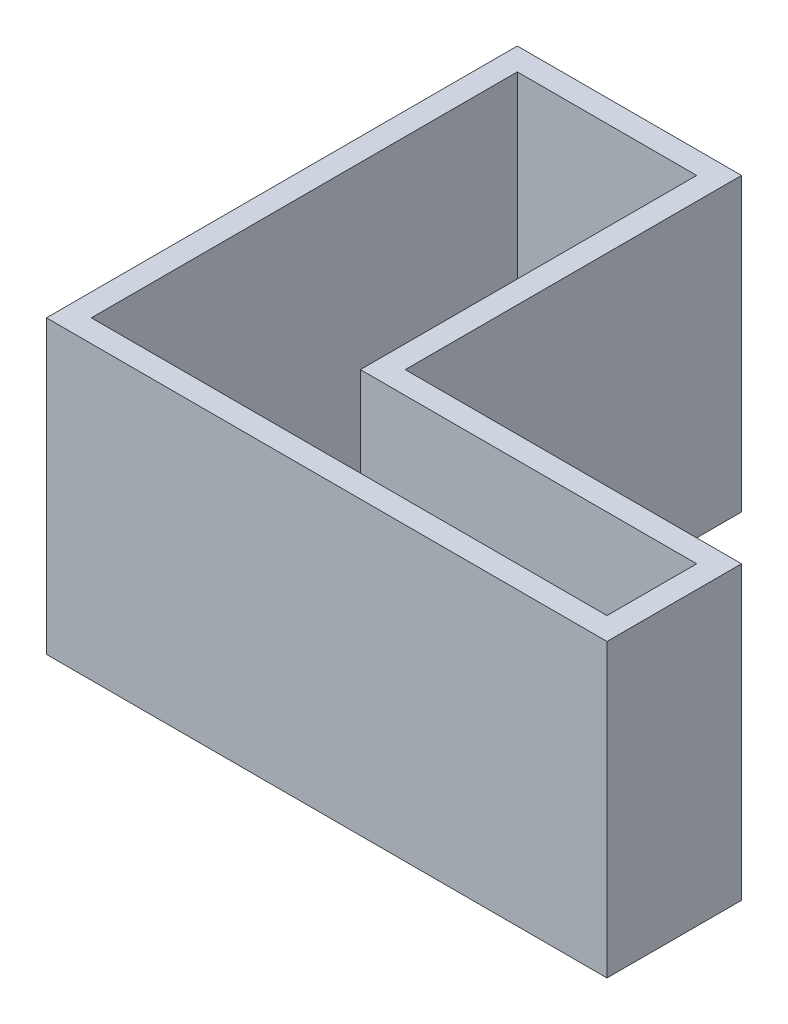
ISO-10303-21;
HEADER;
FILE_DESCRIPTION(('STEP AP214'),'2;1');
FILE_NAME('part.step','',(''),(''),'','','');
FILE_SCHEMA(('AUTOMOTIVE_DESIGN { 1 0 10303 214 1 1 1 1 }'));
ENDSEC;
DATA;
#1=APPLICATION_CONTEXT('core data for automotive mechanical design processes');
#2=APPLICATION_PROTOCOL_DEFINITION('international standard','automotive_design',2000,#1);
#3=PRODUCT_CONTEXT('',#1,'mechanical');
#4=PRODUCT('Part','Part','',(#3));
#5=PRODUCT_RELATED_PRODUCT_CATEGORY('part','',(#4));
#6=PRODUCT_DEFINITION_FORMATION('','',#4);
#7=PRODUCT_DEFINITION_CONTEXT('part definition',#1,'design');
#8=PRODUCT_DEFINITION('design','',#6,#7);
#9=PRODUCT_DEFINITION_SHAPE('','',#8);
#10=(LENGTH_UNIT() NAMED_UNIT(*) SI_UNIT(.MILLI.,.METRE.));
#11=(NAMED_UNIT(*) PLANE_ANGLE_UNIT() SI_UNIT($,.RADIAN.));
#12=(NAMED_UNIT(*) SI_UNIT($,.STERADIAN.) SOLID_ANGLE_UNIT());
#13=UNCERTAINTY_MEASURE_WITH_UNIT(LENGTH_MEASURE(1.E-05),#10,'distance_accuracy_value','');
#14=(GEOMETRIC_REPRESENTATION_CONTEXT(3) GLOBAL_UNCERTAINTY_ASSIGNED_CONTEXT((#13)) GLOBAL_UNIT_ASSIGNED_CONTEXT((#10,
#11,#12)) REPRESENTATION_CONTEXT('',''));
#15=CARTESIAN_POINT('',(0.,0.,0.));
#16=DIRECTION('',(0.,0.,1.));
#17=DIRECTION('',(1.,0.,0.));
#18=AXIS2_PLACEMENT_3D('',#15,#16,#17);
#19=CARTESIAN_POINT('',(0.,12.,0.));
#20=DIRECTION('',(0.,-1.,0.));
#21=DIRECTION('',(0.,0.,-1.));
#22=AXIS2_PLACEMENT_3D('',#19,#20,#21);
#23=PLANE('',#22);
#24=DIRECTION('',(1.,0.,0.));
#25=VECTOR('',#24,1.);
#26=CARTESIAN_POINT('',(25.,12.,0.));
#27=LINE('',#26,#25);
#28=CARTESIAN_POINT('',(0.,12.,0.));
#29=VERTEX_POINT('',#28);
#30=CARTESIAN_POINT('',(25.,12.,0.));
#31=VERTEX_POINT('',#30);
#32=EDGE_CURVE('E199',#29,#31,#27,.T.);
#33=ORIENTED_EDGE('',*,*,#32,.T.);
#34=DIRECTION('',(0.,0.,-1.));
#35=VECTOR('',#34,1.);
#36=CARTESIAN_POINT('',(25.,12.,-6.));
#37=LINE('',#36,#35);
#38=CARTESIAN_POINT('',(25.,12.,-6.));
#39=VERTEX_POINT('',#38);
#40=EDGE_CURVE('E202',#31,#39,#37,.T.);
#41=ORIENTED_EDGE('',*,*,#40,.T.);
#42=DIRECTION('',(-1.,0.,0.));
#43=VECTOR('',#42,1.);
#44=CARTESIAN_POINT('',(10.,12.,-6.));
#45=LINE('',#44,#43);
#46=CARTESIAN_POINT('',(10.,12.,-6.));
#47=VERTEX_POINT('',#46);
#48=EDGE_CURVE('E204',#39,#47,#45,.T.);
#49=ORIENTED_EDGE('',*,*,#48,.T.);
#50=DIRECTION('',(0.,0.,-1.));
#51=VECTOR('',#50,1.);
#52=CARTESIAN_POINT('',(10.,12.,-21.));
#53=LINE('',#52,#51);
#54=CARTESIAN_POINT('',(10.,12.,-21.));
#55=VERTEX_POINT('',#54);
#56=EDGE_CURVE('E132',#47,#55,#53,.T.);
#57=ORIENTED_EDGE('',*,*,#56,.T.);
#58=DIRECTION('',(-1.,0.,0.));
#59=VECTOR('',#58,1.);
#60=CARTESIAN_POINT('',(0.,12.,-21.));
#61=LINE('',#60,#59);
#62=CARTESIAN_POINT('',(0.,12.,-21.));
#63=VERTEX_POINT('',#62);
#64=EDGE_CURVE('E207',#55,#63,#61,.T.);
#65=ORIENTED_EDGE('',*,*,#64,.T.);
#66=DIRECTION('',(0.,0.,1.));
#67=VECTOR('',#66,1.);
#68=CARTESIAN_POINT('',(0.,12.,0.));
#69=LINE('',#68,#67);
#70=EDGE_CURVE('E209',#63,#29,#69,.T.);
#71=ORIENTED_EDGE('',*,*,#70,.T.);
#72=EDGE_LOOP('',(#33,#41,#49,#57,#65,#71));
#73=FACE_BOUND('',#72,.T.);
#74=DIRECTION('',(0.,0.,1.));
#75=VECTOR('',#74,1.);
#76=CARTESIAN_POINT('',(1.,12.,-1.));
#77=LINE('',#76,#75);
#78=CARTESIAN_POINT('',(1.,12.,-20.));
#79=VERTEX_POINT('',#78);
#80=CARTESIAN_POINT('',(1.,12.,-1.));
#81=VERTEX_POINT('',#80);
#82=EDGE_CURVE('E160',#79,#81,#77,.T.);
#83=ORIENTED_EDGE('',*,*,#82,.F.);
#84=DIRECTION('',(-1.,0.,0.));
#85=VECTOR('',#84,1.);
#86=CARTESIAN_POINT('',(1.,12.,-20.));
#87=LINE('',#86,#85);
#88=CARTESIAN_POINT('',(9.00000000000003,12.,-20.));
#89=VERTEX_POINT('',#88);
#90=EDGE_CURVE('E171',#89,#79,#87,.T.);
#91=ORIENTED_EDGE('',*,*,#90,.F.);
#92=DIRECTION('',(0.,0.,-1.));
#93=VECTOR('',#92,1.);
#94=CARTESIAN_POINT('',(9.00000000000003,12.,-20.));
#95=LINE('',#94,#93);
#96=CARTESIAN_POINT('',(9.00000000000003,12.,-5.));
#97=VERTEX_POINT('',#96);
#98=EDGE_CURVE('E169',#97,#89,#95,.T.);
#99=ORIENTED_EDGE('',*,*,#98,.F.);
#100=DIRECTION('',(-1.,0.,0.));
#101=VECTOR('',#100,1.);
#102=CARTESIAN_POINT('',(9.00000000000003,12.,-5.));
#103=LINE('',#102,#101);
#104=CARTESIAN_POINT('',(24.,12.,-5.));
#105=VERTEX_POINT('',#104);
#106=EDGE_CURVE('E167',#105,#97,#103,.T.);
#107=ORIENTED_EDGE('',*,*,#106,.F.);
#108=DIRECTION('',(0.,0.,-1.));
#109=VECTOR('',#108,1.);
#110=CARTESIAN_POINT('',(24.,12.,-5.));
#111=LINE('',#110,#109);
#112=CARTESIAN_POINT('',(24.,12.,-1.));
#113=VERTEX_POINT('',#112);
#114=EDGE_CURVE('E165',#113,#105,#111,.T.);
#115=ORIENTED_EDGE('',*,*,#114,.F.);
#116=DIRECTION('',(1.,0.,0.));
#117=VECTOR('',#116,1.);
#118=CARTESIAN_POINT('',(24.,12.,-1.));
#119=LINE('',#118,#117);
#120=EDGE_CURVE('E162',#81,#113,#119,.T.);
#121=ORIENTED_EDGE('',*,*,#120,.F.);
#122=EDGE_LOOP('',(#83,#91,#99,#107,#115,#121));
#123=FACE_BOUND('',#122,.T.);
#124=ADVANCED_FACE('F35',(#73,#123),#23,.F.);
#125=CARTESIAN_POINT('',(25.,12.,0.));
#126=DIRECTION('',(0.,0.,-1.));
#127=DIRECTION('',(-1.,0.,0.));
#128=AXIS2_PLACEMENT_3D('',#125,#126,#127);
#129=PLANE('',#128);
#130=DIRECTION('',(0.,-1.,0.));
#131=VECTOR('',#130,1.);
#132=CARTESIAN_POINT('',(0.,12.,0.));
#133=LINE('',#132,#131);
#134=CARTESIAN_POINT('',(0.,-1.,0.));
#135=VERTEX_POINT('',#134);
#136=EDGE_CURVE('E211',#29,#135,#133,.T.);
#137=ORIENTED_EDGE('',*,*,#136,.T.);
#138=DIRECTION('',(-1.,0.,0.));
#139=VECTOR('',#138,1.);
#140=CARTESIAN_POINT('',(0.,-1.,0.));
#141=LINE('',#140,#139);
#142=CARTESIAN_POINT('',(25.,-1.,0.));
#143=VERTEX_POINT('',#142);
#144=EDGE_CURVE('E154',#143,#135,#141,.T.);
#145=ORIENTED_EDGE('',*,*,#144,.F.);
#146=DIRECTION('',(0.,-1.,0.));
#147=VECTOR('',#146,1.);
#148=CARTESIAN_POINT('',(25.,12.,0.));
#149=LINE('',#148,#147);
#150=EDGE_CURVE('E11',#31,#143,#149,.T.);
#151=ORIENTED_EDGE('',*,*,#150,.F.);
#152=ORIENTED_EDGE('',*,*,#32,.F.);
#153=EDGE_LOOP('',(#137,#145,#151,#152));
#154=FACE_BOUND('',#153,.T.);
#155=ADVANCED_FACE('F37',(#154),#129,.F.);
#156=CARTESIAN_POINT('',(25.,12.,-6.));
#157=DIRECTION('',(-1.,0.,0.));
#158=DIRECTION('',(0.,0.,1.));
#159=AXIS2_PLACEMENT_3D('',#156,#157,#158);
#160=PLANE('',#159);
#161=ORIENTED_EDGE('',*,*,#150,.T.);
#162=DIRECTION('',(0.,0.,1.));
#163=VECTOR('',#162,1.);
#164=CARTESIAN_POINT('',(25.,-1.,0.));
#165=LINE('',#164,#163);
#166=CARTESIAN_POINT('',(25.,-1.,-6.));
#167=VERTEX_POINT('',#166);
#168=EDGE_CURVE('E144',#167,#143,#165,.T.);
#169=ORIENTED_EDGE('',*,*,#168,.F.);
#170=DIRECTION('',(0.,-1.,0.));
#171=VECTOR('',#170,1.);
#172=CARTESIAN_POINT('',(25.,12.,-6.));
#173=LINE('',#172,#171);
#174=EDGE_CURVE('E43',#39,#167,#173,.T.);
#175=ORIENTED_EDGE('',*,*,#174,.F.);
#176=ORIENTED_EDGE('',*,*,#40,.F.);
#177=EDGE_LOOP('',(#161,#169,#175,#176));
#178=FACE_BOUND('',#177,.T.);
#179=ADVANCED_FACE('F226',(#178),#160,.F.);
#180=CARTESIAN_POINT('',(10.,12.,-6.));
#181=DIRECTION('',(0.,0.,1.));
#182=DIRECTION('',(1.,0.,0.));
#183=AXIS2_PLACEMENT_3D('',#180,#181,#182);
#184=PLANE('',#183);
#185=ORIENTED_EDGE('',*,*,#174,.T.);
#186=DIRECTION('',(1.,0.,0.));
#187=VECTOR('',#186,1.);
#188=CARTESIAN_POINT('',(25.,-1.,-6.));
#189=LINE('',#188,#187);
#190=CARTESIAN_POINT('',(10.,-1.,-6.));
#191=VERTEX_POINT('',#190);
#192=EDGE_CURVE('E138',#191,#167,#189,.T.);
#193=ORIENTED_EDGE('',*,*,#192,.F.);
#194=DIRECTION('',(0.,-1.,0.));
#195=VECTOR('',#194,1.);
#196=CARTESIAN_POINT('',(10.,12.,-6.));
#197=LINE('',#196,#195);
#198=EDGE_CURVE('E126',#47,#191,#197,.T.);
#199=ORIENTED_EDGE('',*,*,#198,.F.);
#200=ORIENTED_EDGE('',*,*,#48,.F.);
#201=EDGE_LOOP('',(#185,#193,#199,#200));
#202=FACE_BOUND('',#201,.T.);
#203=ADVANCED_FACE('F139',(#202),#184,.F.);
#204=CARTESIAN_POINT('',(10.,12.,-21.));
#205=DIRECTION('',(-1.,0.,0.));
#206=DIRECTION('',(0.,0.,1.));
#207=AXIS2_PLACEMENT_3D('',#204,#205,#206);
#208=PLANE('',#207);
#209=ORIENTED_EDGE('',*,*,#198,.T.);
#210=DIRECTION('',(0.,0.,1.));
#211=VECTOR('',#210,1.);
#212=CARTESIAN_POINT('',(10.,-1.,-6.));
#213=LINE('',#212,#211);
#214=CARTESIAN_POINT('',(10.,-1.,-21.));
#215=VERTEX_POINT('',#214);
#216=EDGE_CURVE('E131',#215,#191,#213,.T.);
#217=ORIENTED_EDGE('',*,*,#216,.F.);
#218=DIRECTION('',(0.,-1.,0.));
#219=VECTOR('',#218,1.);
#220=CARTESIAN_POINT('',(10.,12.,-21.));
#221=LINE('',#220,#219);
#222=EDGE_CURVE('E135',#55,#215,#221,.T.);
#223=ORIENTED_EDGE('',*,*,#222,.F.);
#224=ORIENTED_EDGE('',*,*,#56,.F.);
#225=EDGE_LOOP('',(#209,#217,#223,#224));
#226=FACE_BOUND('',#225,.T.);
#227=ADVANCED_FACE('F128',(#226),#208,.F.);
#228=CARTESIAN_POINT('',(0.,12.,-21.));
#229=DIRECTION('',(0.,0.,1.));
#230=DIRECTION('',(1.,0.,0.));
#231=AXIS2_PLACEMENT_3D('',#228,#229,#230);
#232=PLANE('',#231);
#233=ORIENTED_EDGE('',*,*,#222,.T.);
#234=DIRECTION('',(1.,0.,0.));
#235=VECTOR('',#234,1.);
#236=CARTESIAN_POINT('',(10.,-1.,-21.));
#237=LINE('',#236,#235);
#238=CARTESIAN_POINT('',(0.,-1.,-21.));
#239=VERTEX_POINT('',#238);
#240=EDGE_CURVE('E150',#239,#215,#237,.T.);
#241=ORIENTED_EDGE('',*,*,#240,.F.);
#242=DIRECTION('',(0.,-1.,0.));
#243=VECTOR('',#242,1.);
#244=CARTESIAN_POINT('',(0.,12.,-21.));
#245=LINE('',#244,#243);
#246=EDGE_CURVE('E213',#63,#239,#245,.T.);
#247=ORIENTED_EDGE('',*,*,#246,.F.);
#248=ORIENTED_EDGE('',*,*,#64,.F.);
#249=EDGE_LOOP('',(#233,#241,#247,#248));
#250=FACE_BOUND('',#249,.T.);
#251=ADVANCED_FACE('F217',(#250),#232,.F.);
#252=CARTESIAN_POINT('',(0.,12.,0.));
#253=DIRECTION('',(1.,0.,0.));
#254=DIRECTION('',(0.,0.,-1.));
#255=AXIS2_PLACEMENT_3D('',#252,#253,#254);
#256=PLANE('',#255);
#257=ORIENTED_EDGE('',*,*,#246,.T.);
#258=DIRECTION('',(0.,0.,-1.));
#259=VECTOR('',#258,1.);
#260=CARTESIAN_POINT('',(0.,-1.,-21.));
#261=LINE('',#260,#259);
#262=EDGE_CURVE('E157',#135,#239,#261,.T.);
#263=ORIENTED_EDGE('',*,*,#262,.F.);
#264=ORIENTED_EDGE('',*,*,#136,.F.);
#265=ORIENTED_EDGE('',*,*,#70,.F.);
#266=EDGE_LOOP('',(#257,#263,#264,#265));
#267=FACE_BOUND('',#266,.T.);
#268=ADVANCED_FACE('F231',(#267),#256,.F.);
#269=CARTESIAN_POINT('',(1.,12.,-1.));
#270=DIRECTION('',(1.,0.,0.));
#271=DIRECTION('',(0.,0.,-1.));
#272=AXIS2_PLACEMENT_3D('',#269,#270,#271);
#273=PLANE('',#272);
#274=DIRECTION('',(0.,0.,1.));
#275=VECTOR('',#274,1.);
#276=CARTESIAN_POINT('',(1.,0.,-1.));
#277=LINE('',#276,#275);
#278=CARTESIAN_POINT('',(1.,0.,-20.));
#279=VERTEX_POINT('',#278);
#280=CARTESIAN_POINT('',(1.,0.,-1.));
#281=VERTEX_POINT('',#280);
#282=EDGE_CURVE('E58',#279,#281,#277,.T.);
#283=ORIENTED_EDGE('',*,*,#282,.F.);
#284=DIRECTION('',(0.,-1.,0.));
#285=VECTOR('',#284,1.);
#286=CARTESIAN_POINT('',(1.,12.,-20.));
#287=LINE('',#286,#285);
#288=EDGE_CURVE('E173',#79,#279,#287,.T.);
#289=ORIENTED_EDGE('',*,*,#288,.F.);
#290=ORIENTED_EDGE('',*,*,#82,.T.);
#291=DIRECTION('',(0.,-1.,0.));
#292=VECTOR('',#291,1.);
#293=CARTESIAN_POINT('',(1.,12.,-1.));
#294=LINE('',#293,#292);
#295=EDGE_CURVE('E197',#81,#281,#294,.T.);
#296=ORIENTED_EDGE('',*,*,#295,.T.);
#297=EDGE_LOOP('',(#283,#289,#290,#296));
#298=FACE_BOUND('',#297,.T.);
#299=ADVANCED_FACE('F233',(#298),#273,.T.);
#300=CARTESIAN_POINT('',(24.,12.,-1.));
#301=DIRECTION('',(0.,0.,-1.));
#302=DIRECTION('',(-1.,0.,0.));
#303=AXIS2_PLACEMENT_3D('',#300,#301,#302);
#304=PLANE('',#303);
#305=DIRECTION('',(1.,0.,0.));
#306=VECTOR('',#305,1.);
#307=CARTESIAN_POINT('',(24.,0.,-1.));
#308=LINE('',#307,#306);
#309=CARTESIAN_POINT('',(24.,0.,-1.));
#310=VERTEX_POINT('',#309);
#311=EDGE_CURVE('E175',#281,#310,#308,.T.);
#312=ORIENTED_EDGE('',*,*,#311,.F.);
#313=ORIENTED_EDGE('',*,*,#295,.F.);
#314=ORIENTED_EDGE('',*,*,#120,.T.);
#315=DIRECTION('',(0.,-1.,0.));
#316=VECTOR('',#315,1.);
#317=CARTESIAN_POINT('',(24.,12.,-1.));
#318=LINE('',#317,#316);
#319=EDGE_CURVE('E195',#113,#310,#318,.T.);
#320=ORIENTED_EDGE('',*,*,#319,.T.);
#321=EDGE_LOOP('',(#312,#313,#314,#320));
#322=FACE_BOUND('',#321,.T.);
#323=ADVANCED_FACE('F239',(#322),#304,.T.);
#324=CARTESIAN_POINT('',(24.,12.,-5.));
#325=DIRECTION('',(-1.,0.,0.));
#326=DIRECTION('',(0.,0.,1.));
#327=AXIS2_PLACEMENT_3D('',#324,#325,#326);
#328=PLANE('',#327);
#329=DIRECTION('',(0.,0.,-1.));
#330=VECTOR('',#329,1.);
#331=CARTESIAN_POINT('',(24.,0.,-5.));
#332=LINE('',#331,#330);
#333=CARTESIAN_POINT('',(24.,0.,-5.));
#334=VERTEX_POINT('',#333);
#335=EDGE_CURVE('E178',#310,#334,#332,.T.);
#336=ORIENTED_EDGE('',*,*,#335,.F.);
#337=ORIENTED_EDGE('',*,*,#319,.F.);
#338=ORIENTED_EDGE('',*,*,#114,.T.);
#339=DIRECTION('',(0.,-1.,0.));
#340=VECTOR('',#339,1.);
#341=CARTESIAN_POINT('',(24.,12.,-5.));
#342=LINE('',#341,#340);
#343=EDGE_CURVE('E193',#105,#334,#342,.T.);
#344=ORIENTED_EDGE('',*,*,#343,.T.);
#345=EDGE_LOOP('',(#336,#337,#338,#344));
#346=FACE_BOUND('',#345,.T.);
#347=ADVANCED_FACE('F250',(#346),#328,.T.);
#348=CARTESIAN_POINT('',(9.00000000000003,12.,-5.));
#349=DIRECTION('',(0.,0.,1.));
#350=DIRECTION('',(1.,0.,0.));
#351=AXIS2_PLACEMENT_3D('',#348,#349,#350);
#352=PLANE('',#351);
#353=DIRECTION('',(-1.,0.,0.));
#354=VECTOR('',#353,1.);
#355=CARTESIAN_POINT('',(9.00000000000003,0.,-5.));
#356=LINE('',#355,#354);
#357=CARTESIAN_POINT('',(9.00000000000003,0.,-5.));
#358=VERTEX_POINT('',#357);
#359=EDGE_CURVE('E181',#334,#358,#356,.T.);
#360=ORIENTED_EDGE('',*,*,#359,.F.);
#361=ORIENTED_EDGE('',*,*,#343,.F.);
#362=ORIENTED_EDGE('',*,*,#106,.T.);
#363=DIRECTION('',(0.,-1.,0.));
#364=VECTOR('',#363,1.);
#365=CARTESIAN_POINT('',(9.00000000000003,12.,-5.));
#366=LINE('',#365,#364);
#367=EDGE_CURVE('E191',#97,#358,#366,.T.);
#368=ORIENTED_EDGE('',*,*,#367,.T.);
#369=EDGE_LOOP('',(#360,#361,#362,#368));
#370=FACE_BOUND('',#369,.T.);
#371=ADVANCED_FACE('F254',(#370),#352,.T.);
#372=CARTESIAN_POINT('',(9.00000000000003,12.,-20.));
#373=DIRECTION('',(-1.,0.,0.));
#374=DIRECTION('',(0.,0.,1.));
#375=AXIS2_PLACEMENT_3D('',#372,#373,#374);
#376=PLANE('',#375);
#377=DIRECTION('',(0.,0.,-1.));
#378=VECTOR('',#377,1.);
#379=CARTESIAN_POINT('',(9.00000000000003,0.,-20.));
#380=LINE('',#379,#378);
#381=CARTESIAN_POINT('',(9.00000000000003,0.,-20.));
#382=VERTEX_POINT('',#381);
#383=EDGE_CURVE('E184',#358,#382,#380,.T.);
#384=ORIENTED_EDGE('',*,*,#383,.F.);
#385=ORIENTED_EDGE('',*,*,#367,.F.);
#386=ORIENTED_EDGE('',*,*,#98,.T.);
#387=DIRECTION('',(0.,-1.,0.));
#388=VECTOR('',#387,1.);
#389=CARTESIAN_POINT('',(9.00000000000003,12.,-20.));
#390=LINE('',#389,#388);
#391=EDGE_CURVE('E50',#89,#382,#390,.T.);
#392=ORIENTED_EDGE('',*,*,#391,.T.);
#393=EDGE_LOOP('',(#384,#385,#386,#392));
#394=FACE_BOUND('',#393,.T.);
#395=ADVANCED_FACE('F258',(#394),#376,.T.);
#396=CARTESIAN_POINT('',(1.,12.,-20.));
#397=DIRECTION('',(0.,0.,1.));
#398=DIRECTION('',(1.,0.,0.));
#399=AXIS2_PLACEMENT_3D('',#396,#397,#398);
#400=PLANE('',#399);
#401=DIRECTION('',(-1.,0.,0.));
#402=VECTOR('',#401,1.);
#403=CARTESIAN_POINT('',(1.,0.,-20.));
#404=LINE('',#403,#402);
#405=EDGE_CURVE('E163',#382,#279,#404,.T.);
#406=ORIENTED_EDGE('',*,*,#405,.F.);
#407=ORIENTED_EDGE('',*,*,#391,.F.);
#408=ORIENTED_EDGE('',*,*,#90,.T.);
#409=ORIENTED_EDGE('',*,*,#288,.T.);
#410=EDGE_LOOP('',(#406,#407,#408,#409));
#411=FACE_BOUND('',#410,.T.);
#412=ADVANCED_FACE('F262',(#411),#400,.T.);
#413=CARTESIAN_POINT('',(0.,0.,0.));
#414=DIRECTION('',(0.,1.,0.));
#415=DIRECTION('',(0.,0.,1.));
#416=AXIS2_PLACEMENT_3D('',#413,#414,#415);
#417=PLANE('',#416);
#418=ORIENTED_EDGE('',*,*,#383,.T.);
#419=ORIENTED_EDGE('',*,*,#405,.T.);
#420=ORIENTED_EDGE('',*,*,#282,.T.);
#421=ORIENTED_EDGE('',*,*,#311,.T.);
#422=ORIENTED_EDGE('',*,*,#335,.T.);
#423=ORIENTED_EDGE('',*,*,#359,.T.);
#424=EDGE_LOOP('',(#418,#419,#420,#421,#422,#423));
#425=FACE_BOUND('',#424,.T.);
#426=ADVANCED_FACE('F266',(#425),#417,.T.);
#427=CARTESIAN_POINT('',(0.,-1.,0.));
#428=DIRECTION('',(0.,1.,0.));
#429=DIRECTION('',(0.,0.,1.));
#430=AXIS2_PLACEMENT_3D('',#427,#428,#429);
#431=PLANE('',#430);
#432=ORIENTED_EDGE('',*,*,#216,.T.);
#433=ORIENTED_EDGE('',*,*,#192,.T.);
#434=ORIENTED_EDGE('',*,*,#168,.T.);
#435=ORIENTED_EDGE('',*,*,#144,.T.);
#436=ORIENTED_EDGE('',*,*,#262,.T.);
#437=ORIENTED_EDGE('',*,*,#240,.T.);
#438=EDGE_LOOP('',(#432,#433,#434,#435,#436,#437));
#439=FACE_BOUND('',#438,.T.);
#440=ADVANCED_FACE('F147',(#439),#431,.F.);
#441=CLOSED_SHELL('',(#124,#155,#179,#203,#227,#251,#268,#299,#323,#347,#371,#395,#412,#426,#440));
#442=MANIFOLD_SOLID_BREP('B2',#441);
#443=ADVANCED_BREP_SHAPE_REPRESENTATION('',(#18,#442),#14);
#444=SHAPE_DEFINITION_REPRESENTATION(#9,#443);
ENDSEC;
END-ISO-10303-21;
